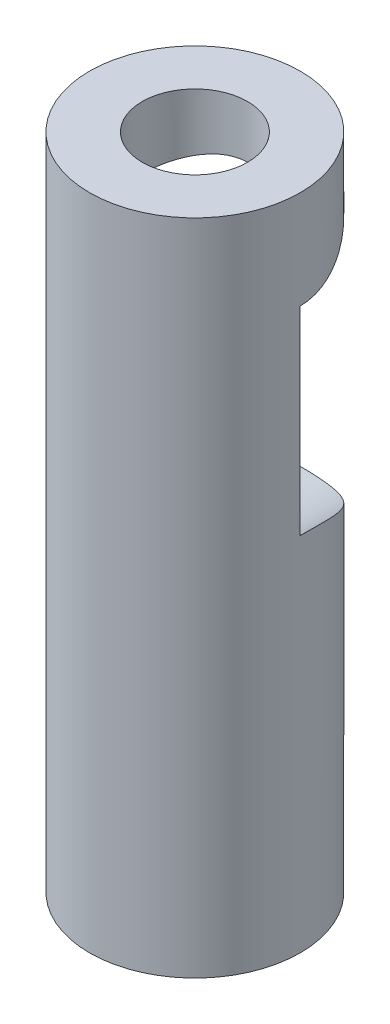
ISO-10303-21;
HEADER;
FILE_DESCRIPTION(('STEP AP214'),'2;1');
FILE_NAME('part.step','',(''),(''),'','','');
FILE_SCHEMA(('AUTOMOTIVE_DESIGN { 1 0 10303 214 1 1 1 1 }'));
ENDSEC;
DATA;
#1=APPLICATION_CONTEXT('core data for automotive mechanical design processes');
#2=APPLICATION_PROTOCOL_DEFINITION('international standard','automotive_design',2000,#1);
#3=PRODUCT_CONTEXT('',#1,'mechanical');
#4=PRODUCT('Part','Part','',(#3));
#5=PRODUCT_RELATED_PRODUCT_CATEGORY('part','',(#4));
#6=PRODUCT_DEFINITION_FORMATION('','',#4);
#7=PRODUCT_DEFINITION_CONTEXT('part definition',#1,'design');
#8=PRODUCT_DEFINITION('design','',#6,#7);
#9=PRODUCT_DEFINITION_SHAPE('','',#8);
#10=(LENGTH_UNIT() NAMED_UNIT(*) SI_UNIT(.MILLI.,.METRE.));
#11=(NAMED_UNIT(*) PLANE_ANGLE_UNIT() SI_UNIT($,.RADIAN.));
#12=(NAMED_UNIT(*) SI_UNIT($,.STERADIAN.) SOLID_ANGLE_UNIT());
#13=UNCERTAINTY_MEASURE_WITH_UNIT(LENGTH_MEASURE(1.E-05),#10,'distance_accuracy_value','');
#14=(GEOMETRIC_REPRESENTATION_CONTEXT(3) GLOBAL_UNCERTAINTY_ASSIGNED_CONTEXT((#13)) GLOBAL_UNIT_ASSIGNED_CONTEXT((#10,
#11,#12)) REPRESENTATION_CONTEXT('',''));
#15=CARTESIAN_POINT('',(0.,0.,0.));
#16=DIRECTION('',(0.,0.,1.));
#17=DIRECTION('',(1.,0.,0.));
#18=AXIS2_PLACEMENT_3D('',#15,#16,#17);
#19=CARTESIAN_POINT('',(0.,30.,0.));
#20=DIRECTION('',(0.,1.,0.));
#21=DIRECTION('',(0.,0.,1.));
#22=AXIS2_PLACEMENT_3D('',#19,#20,#21);
#23=PLANE('',#22);
#24=CARTESIAN_POINT('',(0.,30.,0.));
#25=DIRECTION('',(0.,1.,0.));
#26=DIRECTION('',(0.,0.,1.));
#27=AXIS2_PLACEMENT_3D('',#24,#25,#26);
#28=CIRCLE('',#27,8.);
#29=CARTESIAN_POINT('',(0.,30.,8.));
#30=VERTEX_POINT('',#29);
#31=EDGE_CURVE('E82',#30,#30,#28,.T.);
#32=ORIENTED_EDGE('',*,*,#31,.T.);
#33=EDGE_LOOP('',(#32));
#34=FACE_BOUND('',#33,.T.);
#35=CARTESIAN_POINT('',(0.,30.,0.));
#36=DIRECTION('',(0.,1.,0.));
#37=DIRECTION('',(0.,0.,1.));
#38=AXIS2_PLACEMENT_3D('',#35,#36,#37);
#39=CIRCLE('',#38,4.);
#40=CARTESIAN_POINT('',(0.,30.,4.));
#41=VERTEX_POINT('',#40);
#42=EDGE_CURVE('E134',#41,#41,#39,.T.);
#43=ORIENTED_EDGE('',*,*,#42,.F.);
#44=EDGE_LOOP('',(#43));
#45=FACE_BOUND('',#44,.T.);
#46=ADVANCED_FACE('F37',(#34,#45),#23,.T.);
#47=CARTESIAN_POINT('',(0.,30.,0.));
#48=DIRECTION('',(0.,-1.,0.));
#49=DIRECTION('',(0.,0.,-1.));
#50=AXIS2_PLACEMENT_3D('',#47,#48,#49);
#51=CYLINDRICAL_SURFACE('',#50,8.);
#52=CARTESIAN_POINT('',(8.,22.5498344352707,0.));
#53=CARTESIAN_POINT('',(8.00000199844028,22.5498283267748,-0.095431619735903));
#54=CARTESIAN_POINT('',(7.99829185030613,22.5516448658461,-0.190845289819358));
#55=CARTESIAN_POINT('',(7.99147154013133,22.5588636209366,-0.381401788861192));
#56=CARTESIAN_POINT('',(7.98636186658306,22.5642653217882,-0.476544654760236));
#57=CARTESIAN_POINT('',(7.96599771885704,22.5857295269759,-0.760858071430158));
#58=CARTESIAN_POINT('',(7.94570789489396,22.6070516367834,-0.949315273757999));
#59=CARTESIAN_POINT('',(7.89252079212855,22.6622153009501,-1.3201596029133));
#60=CARTESIAN_POINT('',(7.8597768360575,22.6959044357565,-1.50259232695924));
#61=CARTESIAN_POINT('',(7.78233790802606,22.7742037192679,-1.86255942916633));
#62=CARTESIAN_POINT('',(7.73763796914071,22.8188184061696,-2.04009173763416));
#63=CARTESIAN_POINT('',(7.63738241548231,22.9167701958739,-2.38808505993314));
#64=CARTESIAN_POINT('',(7.58190686269935,22.9700425233274,-2.55858762017951));
#65=CARTESIAN_POINT('',(7.4605878243306,23.0837219450238,-2.89332521759701));
#66=CARTESIAN_POINT('',(7.39474519261594,23.1441284515671,-3.0575607695594));
#67=CARTESIAN_POINT('',(7.18202214972342,23.3339411249883,-3.54161901399744));
#68=CARTESIAN_POINT('',(7.02023368527078,23.4716469626147,-3.85181522133453));
#69=CARTESIAN_POINT('',(6.73333134985199,23.6994880806395,-4.32492277679641));
#70=CARTESIAN_POINT('',(6.61980446316222,23.7863680652962,-4.4967114611119));
#71=CARTESIAN_POINT('',(6.38027991203498,23.961809481583,-4.83054999310583));
#72=CARTESIAN_POINT('',(6.25428129924246,24.0503710406664,-4.99259909867467));
#73=CARTESIAN_POINT('',(5.99010022099942,24.2273509511195,-5.30667860442995));
#74=CARTESIAN_POINT('',(5.85191139841079,24.3157692029867,-5.45870370406776));
#75=CARTESIAN_POINT('',(5.56366321018976,24.4907364893537,-5.75221313426539));
#76=CARTESIAN_POINT('',(5.4136039064722,24.5772855336001,-5.89369751979669));
#77=CARTESIAN_POINT('',(5.07268105483459,24.7628004419074,-6.19097556003177));
#78=CARTESIAN_POINT('',(4.87943558839651,24.8610603488038,-6.34449483196718));
#79=CARTESIAN_POINT('',(4.47708307115174,25.0501314431433,-6.63454822098208));
#80=CARTESIAN_POINT('',(4.2679727641795,25.1409410934611,-6.77107883597556));
#81=CARTESIAN_POINT('',(3.83513256106445,25.3124127693071,-7.0252860573472));
#82=CARTESIAN_POINT('',(3.61142698628379,25.393091052883,-7.14299295582173));
#83=CARTESIAN_POINT('',(3.15047263728153,25.5419683822454,-7.35792817177386));
#84=CARTESIAN_POINT('',(2.913230495377,25.6101734716181,-7.4551664103162));
#85=CARTESIAN_POINT('',(2.4969052441054,25.7143560433235,-7.60258490513781));
#86=CARTESIAN_POINT('',(2.32065550609699,25.7539663154778,-7.65826322171721));
#87=CARTESIAN_POINT('',(1.96318866507327,25.8249279826338,-7.75759481885437));
#88=CARTESIAN_POINT('',(1.78197270003821,25.8562812524925,-7.80125082933213));
#89=CARTESIAN_POINT('',(1.41577917682509,25.9100777208756,-7.8759422534108));
#90=CARTESIAN_POINT('',(1.23080420976254,25.932526851818,-7.90698607027195));
#91=CARTESIAN_POINT('',(0.858229931091968,25.9680652944712,-7.95605072468404));
#92=CARTESIAN_POINT('',(0.670630527866628,25.9811542785902,-7.97407110643335));
#93=CARTESIAN_POINT('',(0.293764491135456,25.9976978850496,-7.99683814861065));
#94=CARTESIAN_POINT('',(0.1044950041764,26.001130143374,-8.00155399713273));
#95=CARTESIAN_POINT('',(-0.273825049507255,25.9982181955143,-7.99754995701883));
#96=CARTESIAN_POINT('',(-0.462875617068729,25.9918740268275,-7.98883011991499));
#97=CARTESIAN_POINT('',(-0.839354698295174,25.969551159661,-7.9580879589664));
#98=CARTESIAN_POINT('',(-1.02678284905105,25.9535703593646,-7.93606273312143));
#99=CARTESIAN_POINT('',(-1.39861058323798,25.9123269855571,-7.87903975464736));
#100=CARTESIAN_POINT('',(-1.58301017600231,25.8870644406556,-7.84404204200413));
#101=CARTESIAN_POINT('',(-1.94221633406307,25.8286627365174,-7.76277722425624));
#102=CARTESIAN_POINT('',(-2.11714573492718,25.7957755436059,-7.71686963704603));
#103=CARTESIAN_POINT('',(-2.46208470434259,25.7223714164028,-7.61383969395894));
#104=CARTESIAN_POINT('',(-2.63209253063129,25.6818518174012,-7.55671342099306));
#105=CARTESIAN_POINT('',(-2.96628359405316,25.5939133808814,-7.43188840758203));
#106=CARTESIAN_POINT('',(-3.13046834683748,25.5464963552881,-7.36419244340872));
#107=CARTESIAN_POINT('',(-3.45245017139393,25.4455303171054,-7.21885195085001));
#108=CARTESIAN_POINT('',(-3.61024490082421,25.3919790829981,-7.14120381704499));
#109=CARTESIAN_POINT('',(-4.10723322439781,25.2109433781252,-6.8761398426394));
#110=CARTESIAN_POINT('',(-4.43301387434843,25.0729264243898,-6.67032326785322));
#111=CARTESIAN_POINT('',(-5.04705300069744,24.779739203316,-6.21875477141076));
#112=CARTESIAN_POINT('',(-5.33527640466488,24.6245531492814,-5.97296599677597));
#113=CARTESIAN_POINT('',(-5.76334517706154,24.37114358903,-5.55282515325631));
#114=CARTESIAN_POINT('',(-5.91600211574579,24.2753092402855,-5.38986525878157));
#115=CARTESIAN_POINT('',(-6.20709957168977,24.0830786374532,-5.05189730695535));
#116=CARTESIAN_POINT('',(-6.3455372013396,23.986682273417,-4.87688681441458));
#117=CARTESIAN_POINT('',(-6.60781580072394,23.7956304564051,-4.5151654658537));
#118=CARTESIAN_POINT('',(-6.73164763657911,23.7009761237212,-4.32844739898517));
#119=CARTESIAN_POINT('',(-6.96404304665043,23.5161100619673,-3.94367788534587));
#120=CARTESIAN_POINT('',(-7.07261079008392,23.4258971241714,-3.74562955418549));
#121=CARTESIAN_POINT('',(-7.25190718144182,23.2716775910083,-3.3825262508261));
#122=CARTESIAN_POINT('',(-7.32573885539907,23.2062262596215,-3.21961304928722));
#123=CARTESIAN_POINT('',(-7.46305429185733,23.0815482124639,-2.88707158695057));
#124=CARTESIAN_POINT('',(-7.52653489239089,23.0223234006785,-2.71744129386004));
#125=CARTESIAN_POINT('',(-7.64224618476593,22.9121700235792,-2.37255685462584));
#126=CARTESIAN_POINT('',(-7.69452031094044,22.8612096211419,-2.19732756135692));
#127=CARTESIAN_POINT('',(-7.78738008066977,22.7692337590437,-1.84133067170084));
#128=CARTESIAN_POINT('',(-7.8279743299261,22.7282109809089,-1.66056726204907));
#129=CARTESIAN_POINT('',(-7.88491923846396,22.67001191424,-1.35755790266427));
#130=CARTESIAN_POINT('',(-7.90480416197589,22.6494890050168,-1.23660426108263));
#131=CARTESIAN_POINT('',(-7.93906672936823,22.6139232999137,-0.993139038278253));
#132=CARTESIAN_POINT('',(-7.95344576281112,22.5988791213727,-0.870627858218146));
#133=CARTESIAN_POINT('',(-7.97661395080966,22.5745581204995,-0.623760947132065));
#134=CARTESIAN_POINT('',(-7.98536927038406,22.565316214815,-0.49939857380642));
#135=CARTESIAN_POINT('',(-7.99706982307064,22.5529389967196,-0.250028331880553));
#136=CARTESIAN_POINT('',(-8.00001172870602,22.5498071816098,-0.125020134638967));
#137=CARTESIAN_POINT('',(-8.,22.5498344352707,0.));
#138=B_SPLINE_CURVE_WITH_KNOTS('',3,(#52,#53,#54,#55,#56,#57,#58,#59,#60,#61,#62,#63,#64,#65,
#66,#67,#68,#69,#70,#71,#72,#73,#74,#75,#76,#77,#78,#79,#80,#81,#82,#83,#84,#85,#86,#87,#88,#89,
#90,#91,#92,#93,#94,#95,#96,#97,#98,#99,#100,#101,#102,#103,#104,#105,#106,#107,#108,#109,#110,
#111,#112,#113,#114,#115,#116,#117,#118,#119,#120,#121,#122,#123,#124,#125,#126,#127,#128,#129,
#130,#131,#132,#133,#134,#135,#136,#137),.UNSPECIFIED.,.F.,.F.,(4,2,2,2,2,2,2,2,2,2,2,2,2,2,2,2,
2,2,2,2,2,2,2,2,2,2,2,2,2,2,2,2,2,2,2,2,2,2,2,2,2,2,4),(0.,0.28622748510502,0.572413849836,
1.14358691368591,1.70794465918493,2.2725372233638,2.83308515457088,3.39358694109664,
4.51774463546238,5.18777783550204,5.85786202433252,6.52829774847315,7.19872997594122,
7.99457901458489,8.79059184078375,9.58531050369248,10.3796430786503,10.9461691263815,
11.512566426067,12.0785857248521,12.6446248325449,13.2119737557033,13.7793205028185,
14.346791037006,14.9142598220599,15.4651324703859,16.0161978031361,16.5671186339006,
17.118239616497,18.3413433364019,19.5655811757583,20.2939208323176,21.022408106442,
21.7513485587219,22.4800895205932,23.0510323499523,23.622149261184,24.1910109168413,
24.7594523571265,25.1320784078838,25.5046103541491,25.8793631428139,26.2543303700929),.UNSPECIFIED.);
#139=CARTESIAN_POINT('',(8.,22.5498344352707,0.));
#140=VERTEX_POINT('',#139);
#141=CARTESIAN_POINT('',(-8.,22.5498344352707,0.));
#142=VERTEX_POINT('',#141);
#143=EDGE_CURVE('E88',#140,#142,#138,.T.);
#144=ORIENTED_EDGE('',*,*,#143,.T.);
#145=DIRECTION('',(0.,-1.,0.));
#146=VECTOR('',#145,1.);
#147=CARTESIAN_POINT('',(-8.,30.,0.));
#148=LINE('',#147,#146);
#149=CARTESIAN_POINT('',(-8.,7.45016556472925,0.));
#150=VERTEX_POINT('',#149);
#151=EDGE_CURVE('E127',#142,#150,#148,.T.);
#152=ORIENTED_EDGE('',*,*,#151,.T.);
#153=CARTESIAN_POINT('',(-8.,7.45016556472925,0.));
#154=CARTESIAN_POINT('',(-8.00000199844028,7.45017167322521,-0.0954316197359027));
#155=CARTESIAN_POINT('',(-7.99829185030613,7.44835513415394,-0.190845289819358));
#156=CARTESIAN_POINT('',(-7.99147154013133,7.44113637906344,-0.381401788861192));
#157=CARTESIAN_POINT('',(-7.98636186658306,7.43573467821175,-0.476544654760235));
#158=CARTESIAN_POINT('',(-7.96599771885704,7.41427047302411,-0.760858071430158));
#159=CARTESIAN_POINT('',(-7.94570789489396,7.3929483632166,-0.949315273757998));
#160=CARTESIAN_POINT('',(-7.89252079212855,7.33778469904993,-1.3201596029133));
#161=CARTESIAN_POINT('',(-7.8597768360575,7.30409556424353,-1.50259232695924));
#162=CARTESIAN_POINT('',(-7.78233790802606,7.22579628073214,-1.86255942916633));
#163=CARTESIAN_POINT('',(-7.73763796914071,7.18118159383035,-2.04009173763416));
#164=CARTESIAN_POINT('',(-7.63738241548231,7.08322980412607,-2.38808505993314));
#165=CARTESIAN_POINT('',(-7.58190686269935,7.02995747667263,-2.55858762017951));
#166=CARTESIAN_POINT('',(-7.4605878243306,6.91627805497616,-2.89332521759701));
#167=CARTESIAN_POINT('',(-7.39474519261594,6.85587154843294,-3.0575607695594));
#168=CARTESIAN_POINT('',(-7.18202214972342,6.66605887501174,-3.54161901399744));
#169=CARTESIAN_POINT('',(-7.02023368527078,6.52835303738526,-3.85181522133453));
#170=CARTESIAN_POINT('',(-6.73333134985199,6.30051191936046,-4.32492277679641));
#171=CARTESIAN_POINT('',(-6.61980446316221,6.21363193470384,-4.4967114611119));
#172=CARTESIAN_POINT('',(-6.38027991203498,6.038190518417,-4.83054999310584));
#173=CARTESIAN_POINT('',(-6.25428129924246,5.94962895933363,-4.99259909867467));
#174=CARTESIAN_POINT('',(-5.99010022099942,5.77264904888048,-5.30667860442995));
#175=CARTESIAN_POINT('',(-5.85191139841079,5.68423079701328,-5.45870370406776));
#176=CARTESIAN_POINT('',(-5.56366321018976,5.50926351064626,-5.75221313426539));
#177=CARTESIAN_POINT('',(-5.4136039064722,5.42271446639989,-5.89369751979669));
#178=CARTESIAN_POINT('',(-5.07268105483459,5.23719955809264,-6.19097556003177));
#179=CARTESIAN_POINT('',(-4.87943558839651,5.13893965119624,-6.34449483196718));
#180=CARTESIAN_POINT('',(-4.47708307115174,4.94986855685671,-6.63454822098208));
#181=CARTESIAN_POINT('',(-4.2679727641795,4.85905890653886,-6.77107883597556));
#182=CARTESIAN_POINT('',(-3.83513256106445,4.6875872306929,-7.0252860573472));
#183=CARTESIAN_POINT('',(-3.61142698628379,4.60690894711702,-7.14299295582173));
#184=CARTESIAN_POINT('',(-3.15047263728153,4.45803161775459,-7.35792817177386));
#185=CARTESIAN_POINT('',(-2.913230495377,4.38982652838192,-7.4551664103162));
#186=CARTESIAN_POINT('',(-2.4969052441054,4.2856439566765,-7.60258490513781));
#187=CARTESIAN_POINT('',(-2.32065550609699,4.24603368452218,-7.65826322171721));
#188=CARTESIAN_POINT('',(-1.96318866507327,4.17507201736617,-7.75759481885438));
#189=CARTESIAN_POINT('',(-1.78197270003821,4.14371874750747,-7.80125082933213));
#190=CARTESIAN_POINT('',(-1.41577917682508,4.08992227912438,-7.8759422534108));
#191=CARTESIAN_POINT('',(-1.23080420976254,4.06747314818201,-7.90698607027195));
#192=CARTESIAN_POINT('',(-0.858229931091966,4.03193470552875,-7.95605072468404));
#193=CARTESIAN_POINT('',(-0.670630527866626,4.01884572140979,-7.97407110643335));
#194=CARTESIAN_POINT('',(-0.293764491135455,4.00230211495042,-7.99683814861065));
#195=CARTESIAN_POINT('',(-0.104495004176398,3.99886985662602,-8.00155399713273));
#196=CARTESIAN_POINT('',(0.273825049507257,4.00178180448567,-7.99754995701883));
#197=CARTESIAN_POINT('',(0.462875617068731,4.00812597317254,-7.98883011991499));
#198=CARTESIAN_POINT('',(0.839354698295174,4.03044884033903,-7.9580879589664));
#199=CARTESIAN_POINT('',(1.02678284905105,4.04642964063539,-7.93606273312143));
#200=CARTESIAN_POINT('',(1.39861058323798,4.0876730144429,-7.87903975464736));
#201=CARTESIAN_POINT('',(1.58301017600231,4.11293555934439,-7.84404204200413));
#202=CARTESIAN_POINT('',(1.94221633406308,4.17133726348265,-7.76277722425624));
#203=CARTESIAN_POINT('',(2.11714573492718,4.20422445639409,-7.71686963704603));
#204=CARTESIAN_POINT('',(2.46208470434259,4.27762858359719,-7.61383969395894));
#205=CARTESIAN_POINT('',(2.63209253063129,4.31814818259879,-7.55671342099305));
#206=CARTESIAN_POINT('',(2.96628359405316,4.40608661911864,-7.43188840758203));
#207=CARTESIAN_POINT('',(3.13046834683748,4.45350364471193,-7.36419244340872));
#208=CARTESIAN_POINT('',(3.45245017139393,4.55446968289462,-7.21885195085001));
#209=CARTESIAN_POINT('',(3.61024490082421,4.60802091700185,-7.14120381704499));
#210=CARTESIAN_POINT('',(4.10723322439781,4.78905662187485,-6.87613984263939));
#211=CARTESIAN_POINT('',(4.43301387434843,4.92707357561021,-6.67032326785321));
#212=CARTESIAN_POINT('',(5.04705300069744,5.22026079668405,-6.21875477141076));
#213=CARTESIAN_POINT('',(5.33527640466488,5.37544685071862,-5.97296599677597));
#214=CARTESIAN_POINT('',(5.76334517706154,5.62885641096995,-5.55282515325631));
#215=CARTESIAN_POINT('',(5.91600211574579,5.72469075971451,-5.38986525878157));
#216=CARTESIAN_POINT('',(6.20709957168977,5.91692136254679,-5.05189730695535));
#217=CARTESIAN_POINT('',(6.3455372013396,6.01331772658302,-4.87688681441458));
#218=CARTESIAN_POINT('',(6.60781580072394,6.2043695435949,-4.51516546585371));
#219=CARTESIAN_POINT('',(6.73164763657911,6.29902387627875,-4.32844739898517));
#220=CARTESIAN_POINT('',(6.96404304665043,6.48388993803266,-3.94367788534588));
#221=CARTESIAN_POINT('',(7.07261079008392,6.57410287582855,-3.74562955418549));
#222=CARTESIAN_POINT('',(7.25190718144182,6.72832240899172,-3.3825262508261));
#223=CARTESIAN_POINT('',(7.32573885539907,6.79377374037853,-3.21961304928722));
#224=CARTESIAN_POINT('',(7.46305429185733,6.91845178753608,-2.88707158695058));
#225=CARTESIAN_POINT('',(7.52653489239089,6.9776765993215,-2.71744129386004));
#226=CARTESIAN_POINT('',(7.64224618476593,7.08782997642081,-2.37255685462585));
#227=CARTESIAN_POINT('',(7.69452031094043,7.1387903788581,-2.19732756135692));
#228=CARTESIAN_POINT('',(7.78738008066977,7.23076624095631,-1.84133067170085));
#229=CARTESIAN_POINT('',(7.8279743299261,7.27178901909109,-1.66056726204907));
#230=CARTESIAN_POINT('',(7.88491923846395,7.32998808576001,-1.35755790266427));
#231=CARTESIAN_POINT('',(7.90480416197589,7.35051099498324,-1.23660426108263));
#232=CARTESIAN_POINT('',(7.93906672936823,7.38607670008634,-0.993139038278255));
#233=CARTESIAN_POINT('',(7.95344576281112,7.40112087862731,-0.870627858218149));
#234=CARTESIAN_POINT('',(7.97661395080966,7.42544187950053,-0.623760947132067));
#235=CARTESIAN_POINT('',(7.98536927038406,7.43468378518495,-0.499398573806422));
#236=CARTESIAN_POINT('',(7.99706982307064,7.44706100328043,-0.250028331880555));
#237=CARTESIAN_POINT('',(8.00001172870603,7.45019281839017,-0.125020134638968));
#238=CARTESIAN_POINT('',(8.,7.45016556472925,0.));
#239=B_SPLINE_CURVE_WITH_KNOTS('',3,(#153,#154,#155,#156,#157,#158,#159,#160,#161,#162,#163,
#164,#165,#166,#167,#168,#169,#170,#171,#172,#173,#174,#175,#176,#177,#178,#179,#180,#181,#182,
#183,#184,#185,#186,#187,#188,#189,#190,#191,#192,#193,#194,#195,#196,#197,#198,#199,#200,#201,
#202,#203,#204,#205,#206,#207,#208,#209,#210,#211,#212,#213,#214,#215,#216,#217,#218,#219,#220,
#221,#222,#223,#224,#225,#226,#227,#228,#229,#230,#231,#232,#233,#234,#235,#236,#237,#238),
.UNSPECIFIED.,.F.,.F.,(4,2,2,2,2,2,2,2,2,2,2,2,2,2,2,2,2,2,2,2,2,2,2,2,2,2,2,2,2,2,2,2,2,2,2,2,
2,2,2,2,2,2,4),(0.,0.28622748510502,0.572413849835999,1.14358691368591,1.70794465918493,
2.2725372233638,2.83308515457088,3.39358694109664,4.51774463546238,5.18777783550204,
5.85786202433252,6.52829774847315,7.19872997594122,7.99457901458489,8.79059184078375,
9.58531050369248,10.3796430786503,10.9461691263815,11.512566426067,12.0785857248521,
12.6446248325449,13.2119737557033,13.7793205028185,14.346791037006,14.9142598220599,
15.4651324703859,16.0161978031361,16.5671186339006,17.118239616497,18.3413433364019,
19.5655811757583,20.2939208323176,21.022408106442,21.7513485587218,22.4800895205932,
23.0510323499523,23.622149261184,24.1910109168413,24.7594523571265,25.1320784078838,
25.5046103541491,25.8793631428139,26.2543303700929),.UNSPECIFIED.);
#240=CARTESIAN_POINT('',(8.,7.45016556472925,0.));
#241=VERTEX_POINT('',#240);
#242=EDGE_CURVE('E126',#150,#241,#239,.T.);
#243=ORIENTED_EDGE('',*,*,#242,.T.);
#244=DIRECTION('',(0.,-1.,0.));
#245=VECTOR('',#244,1.);
#246=CARTESIAN_POINT('',(8.,30.,0.));
#247=LINE('',#246,#245);
#248=EDGE_CURVE('E90',#241,#140,#247,.F.);
#249=ORIENTED_EDGE('',*,*,#248,.T.);
#250=EDGE_LOOP('',(#144,#152,#243,#249));
#251=FACE_BOUND('',#250,.T.);
#252=ORIENTED_EDGE('',*,*,#31,.F.);
#253=EDGE_LOOP('',(#252));
#254=FACE_BOUND('',#253,.T.);
#255=CARTESIAN_POINT('',(0.,-20.,0.));
#256=DIRECTION('',(0.,-1.,0.));
#257=DIRECTION('',(0.,0.,-1.));
#258=AXIS2_PLACEMENT_3D('',#255,#256,#257);
#259=CIRCLE('',#258,8.);
#260=CARTESIAN_POINT('',(0.,-20.,-8.));
#261=VERTEX_POINT('',#260);
#262=EDGE_CURVE('E146',#261,#261,#259,.T.);
#263=ORIENTED_EDGE('',*,*,#262,.F.);
#264=EDGE_LOOP('',(#263));
#265=FACE_BOUND('',#264,.T.);
#266=ADVANCED_FACE('F39',(#251,#254,#265),#51,.T.);
#267=CARTESIAN_POINT('',(0.,30.,0.));
#268=DIRECTION('',(0.,-1.,0.));
#269=DIRECTION('',(0.,0.,-1.));
#270=AXIS2_PLACEMENT_3D('',#267,#268,#269);
#271=CYLINDRICAL_SURFACE('',#270,4.);
#272=DIRECTION('',(0.,-1.,0.));
#273=VECTOR('',#272,1.);
#274=CARTESIAN_POINT('',(-4.,30.,0.));
#275=LINE('',#274,#273);
#276=CARTESIAN_POINT('',(-4.,25.2469507659596,0.));
#277=VERTEX_POINT('',#276);
#278=CARTESIAN_POINT('',(-4.,4.7530492340404,0.));
#279=VERTEX_POINT('',#278);
#280=EDGE_CURVE('E11',#277,#279,#275,.T.);
#281=ORIENTED_EDGE('',*,*,#280,.F.);
#282=CARTESIAN_POINT('',(4.,25.2469507659596,0.));
#283=CARTESIAN_POINT('',(4.00001506629618,25.2469313120545,-0.108477558843029));
#284=CARTESIAN_POINT('',(3.99558759654818,25.2486728711533,-0.216944401371052));
#285=CARTESIAN_POINT('',(3.97796511816532,25.2555329689245,-0.433022618368093));
#286=CARTESIAN_POINT('',(3.96477288617618,25.2606504381169,-0.540634252841868));
#287=CARTESIAN_POINT('',(3.92979740032967,25.2740947544928,-0.753877275735285));
#288=CARTESIAN_POINT('',(3.90804329121767,25.2824107118169,-0.85951412168963));
#289=CARTESIAN_POINT('',(3.85617600406601,25.3019741161438,-1.06841189769306));
#290=CARTESIAN_POINT('',(3.82606243666696,25.3132216996918,-1.17167271683103));
#291=CARTESIAN_POINT('',(3.72361404417548,25.3508476988465,-1.47667611577799));
#292=CARTESIAN_POINT('',(3.63911135492481,25.3811339859163,-1.67400157027245));
#293=CARTESIAN_POINT('',(3.44036098803054,25.4486780931695,-2.05172943459006));
#294=CARTESIAN_POINT('',(3.32609068287348,25.485941210624,-2.23211882813923));
#295=CARTESIAN_POINT('',(3.0653542941641,25.5651741933544,-2.57927479117736));
#296=CARTESIAN_POINT('',(2.91773340595898,25.6072762987954,-2.74514569335533));
#297=CARTESIAN_POINT('',(2.59694586086137,25.690336539736,-3.05039678297012));
#298=CARTESIAN_POINT('',(2.42377439039872,25.731294457945,-3.18977196743197));
#299=CARTESIAN_POINT('',(2.0500193923818,25.8090212550311,-3.44236320126538));
#300=CARTESIAN_POINT('',(1.84874018053143,25.845615877207,-3.55460837161861));
#301=CARTESIAN_POINT('',(1.42859821417925,25.9089021162938,-3.7432716683795));
#302=CARTESIAN_POINT('',(1.20974170951164,25.9355972343031,-3.81970246356845));
#303=CARTESIAN_POINT('',(0.770126116610721,25.9751354864474,-3.93144020430173));
#304=CARTESIAN_POINT('',(0.5498088117063,25.9884992496064,-3.96829749176194));
#305=CARTESIAN_POINT('',(0.10573396147489,26.0017318475325,-4.00479875074296));
#306=CARTESIAN_POINT('',(-0.1180225752857,26.0016045658519,-4.00445343146143));
#307=CARTESIAN_POINT('',(-0.551545099906521,25.9882062518061,-3.96748382097402));
#308=CARTESIAN_POINT('',(-0.761477378236624,25.9755475501487,-3.93254965293702));
#309=CARTESIAN_POINT('',(-1.17226394649134,25.9393023123449,-3.83022333682287));
#310=CARTESIAN_POINT('',(-1.37311772136676,25.9157151570485,-3.76282934973016));
#311=CARTESIAN_POINT('',(-1.76343292952034,25.8595473870101,-3.59665837324836));
#312=CARTESIAN_POINT('',(-1.95269147493231,25.8268435212879,-3.49744827250839));
#313=CARTESIAN_POINT('',(-2.31233599066249,25.7557777457742,-3.27082630306202));
#314=CARTESIAN_POINT('',(-2.48271605149533,25.7174140730196,-3.14340564088477));
#315=CARTESIAN_POINT('',(-2.80972574444224,25.6365116612934,-2.8557775924849));
#316=CARTESIAN_POINT('',(-2.96507569246687,25.5938593571807,-2.69414776985871));
#317=CARTESIAN_POINT('',(-3.24700232649086,25.5108815019074,-2.34669408834142));
#318=CARTESIAN_POINT('',(-3.37356836574825,25.4705568158001,-2.16086131697851));
#319=CARTESIAN_POINT('',(-3.54016240956462,25.4149302410634,-1.86558976536919));
#320=CARTESIAN_POINT('',(-3.59223322579723,25.3970384333424,-1.76325823832065));
#321=CARTESIAN_POINT('',(-3.68750228530319,25.3636323383352,-1.5541882051343));
#322=CARTESIAN_POINT('',(-3.73070428236142,25.3481170458825,-1.44745158655047));
#323=CARTESIAN_POINT('',(-3.80779139446805,25.3200005007808,-1.2304361889591));
#324=CARTESIAN_POINT('',(-3.8416871452191,25.3073959242428,-1.1201616157295));
#325=CARTESIAN_POINT('',(-3.8998727091522,25.2855215725494,-0.896828970336788));
#326=CARTESIAN_POINT('',(-3.92416687098898,25.2762502878854,-0.78377218296893));
#327=CARTESIAN_POINT('',(-3.96229165305801,25.2616115978763,-0.559278614183592));
#328=CARTESIAN_POINT('',(-3.97642329254164,25.2561320834074,-0.447900257838537));
#329=CARTESIAN_POINT('',(-3.99528154959869,25.2487922541277,-0.224351065921796));
#330=CARTESIAN_POINT('',(-4.00001800323396,25.2469281542918,-0.112181182661626));
#331=CARTESIAN_POINT('',(-4.,25.2469507659596,0.));
#332=B_SPLINE_CURVE_WITH_KNOTS('',3,(#282,#283,#284,#285,#286,#287,#288,#289,#290,#291,#292,
#293,#294,#295,#296,#297,#298,#299,#300,#301,#302,#303,#304,#305,#306,#307,#308,#309,#310,#311,
#312,#313,#314,#315,#316,#317,#318,#319,#320,#321,#322,#323,#324,#325,#326,#327,#328,#329,#330,
#331),.UNSPECIFIED.,.F.,.F.,(4,2,2,2,2,2,2,2,2,2,2,2,2,2,2,2,2,2,2,2,2,2,2,2,4),(0.,
0.325310395428347,0.650517782781825,0.974627603491258,1.29875252283213,1.94591304532233,
2.59356694227547,3.26854149378252,3.94364336903227,4.64017640395484,5.33646286474439,
6.00434645390944,6.67203778562602,7.30863725983086,7.94527280491034,8.59097152050376,
9.23687178993661,9.9184556128784,10.6002911350355,10.9485318545547,11.2966248736591,
11.6443184006235,11.9918542727889,12.3286166822483,12.665026340001),.UNSPECIFIED.);
#333=CARTESIAN_POINT('',(4.,25.2469507659596,0.));
#334=VERTEX_POINT('',#333);
#335=EDGE_CURVE('E81',#334,#277,#332,.T.);
#336=ORIENTED_EDGE('',*,*,#335,.F.);
#337=DIRECTION('',(0.,-1.,0.));
#338=VECTOR('',#337,1.);
#339=CARTESIAN_POINT('',(4.,30.,0.));
#340=LINE('',#339,#338);
#341=CARTESIAN_POINT('',(4.,4.7530492340404,0.));
#342=VERTEX_POINT('',#341);
#343=EDGE_CURVE('E76',#342,#334,#340,.F.);
#344=ORIENTED_EDGE('',*,*,#343,.F.);
#345=CARTESIAN_POINT('',(-4.,4.7530492340404,0.));
#346=CARTESIAN_POINT('',(-4.00001506629618,4.7530686879455,-0.108477558843029));
#347=CARTESIAN_POINT('',(-3.99558759654818,4.75132712884673,-0.216944401371052));
#348=CARTESIAN_POINT('',(-3.97796511816532,4.74446703107549,-0.433022618368093));
#349=CARTESIAN_POINT('',(-3.96477288617618,4.73934956188305,-0.540634252841868));
#350=CARTESIAN_POINT('',(-3.92979740032967,4.72590524550724,-0.753877275735285));
#351=CARTESIAN_POINT('',(-3.90804329121767,4.71758928818309,-0.85951412168963));
#352=CARTESIAN_POINT('',(-3.85617600406601,4.69802588385616,-1.06841189769306));
#353=CARTESIAN_POINT('',(-3.82606243666696,4.6867783003082,-1.17167271683103));
#354=CARTESIAN_POINT('',(-3.72361404417548,4.6491523011535,-1.47667611577799));
#355=CARTESIAN_POINT('',(-3.63911135492481,4.61886601408374,-1.67400157027245));
#356=CARTESIAN_POINT('',(-3.44036098803054,4.55132190683054,-2.05172943459006));
#357=CARTESIAN_POINT('',(-3.32609068287348,4.51405878937601,-2.23211882813923));
#358=CARTESIAN_POINT('',(-3.0653542941641,4.43482580664555,-2.57927479117736));
#359=CARTESIAN_POINT('',(-2.91773340595898,4.39272370120459,-2.74514569335533));
#360=CARTESIAN_POINT('',(-2.59694586086137,4.30966346026395,-3.05039678297012));
#361=CARTESIAN_POINT('',(-2.42377439039872,4.26870554205502,-3.18977196743197));
#362=CARTESIAN_POINT('',(-2.0500193923818,4.19097874496894,-3.44236320126538));
#363=CARTESIAN_POINT('',(-1.84874018053143,4.15438412279298,-3.55460837161861));
#364=CARTESIAN_POINT('',(-1.42859821417925,4.09109788370617,-3.7432716683795));
#365=CARTESIAN_POINT('',(-1.20974170951164,4.06440276569694,-3.81970246356845));
#366=CARTESIAN_POINT('',(-0.770126116610722,4.02486451355257,-3.93144020430173));
#367=CARTESIAN_POINT('',(-0.549808811706302,4.01150075039356,-3.96829749176194));
#368=CARTESIAN_POINT('',(-0.105733961474892,3.99826815246751,-4.00479875074296));
#369=CARTESIAN_POINT('',(0.118022575285698,3.99839543414808,-4.00445343146143));
#370=CARTESIAN_POINT('',(0.55154509990652,4.01179374819387,-3.96748382097402));
#371=CARTESIAN_POINT('',(0.761477378236623,4.02445244985134,-3.93254965293702));
#372=CARTESIAN_POINT('',(1.17226394649134,4.06069768765506,-3.83022333682287));
#373=CARTESIAN_POINT('',(1.37311772136676,4.08428484295147,-3.76282934973016));
#374=CARTESIAN_POINT('',(1.76343292952034,4.1404526129899,-3.59665837324836));
#375=CARTESIAN_POINT('',(1.95269147493231,4.17315647871207,-3.49744827250839));
#376=CARTESIAN_POINT('',(2.31233599066249,4.2442222542258,-3.27082630306202));
#377=CARTESIAN_POINT('',(2.48271605149533,4.28258592698037,-3.14340564088477));
#378=CARTESIAN_POINT('',(2.80972574444224,4.36348833870661,-2.8557775924849));
#379=CARTESIAN_POINT('',(2.96507569246687,4.40614064281928,-2.69414776985871));
#380=CARTESIAN_POINT('',(3.24700232649086,4.48911849809259,-2.34669408834142));
#381=CARTESIAN_POINT('',(3.37356836574825,4.52944318419986,-2.16086131697851));
#382=CARTESIAN_POINT('',(3.54016240956462,4.58506975893664,-1.86558976536919));
#383=CARTESIAN_POINT('',(3.59223322579723,4.60296156665764,-1.76325823832065));
#384=CARTESIAN_POINT('',(3.68750228530319,4.63636766166479,-1.5541882051343));
#385=CARTESIAN_POINT('',(3.73070428236142,4.6518829541175,-1.44745158655047));
#386=CARTESIAN_POINT('',(3.80779139446805,4.67999949921925,-1.2304361889591));
#387=CARTESIAN_POINT('',(3.8416871452191,4.69260407575721,-1.1201616157295));
#388=CARTESIAN_POINT('',(3.8998727091522,4.71447842745056,-0.896828970336789));
#389=CARTESIAN_POINT('',(3.92416687098898,4.72374971211462,-0.783772182968931));
#390=CARTESIAN_POINT('',(3.96229165305801,4.73838840212368,-0.559278614183594));
#391=CARTESIAN_POINT('',(3.97642329254164,4.74386791659256,-0.447900257838539));
#392=CARTESIAN_POINT('',(3.99528154959869,4.75120774587225,-0.224351065921797));
#393=CARTESIAN_POINT('',(4.00001800323396,4.75307184570818,-0.112181182661626));
#394=CARTESIAN_POINT('',(4.,4.7530492340404,0.));
#395=B_SPLINE_CURVE_WITH_KNOTS('',3,(#345,#346,#347,#348,#349,#350,#351,#352,#353,#354,#355,
#356,#357,#358,#359,#360,#361,#362,#363,#364,#365,#366,#367,#368,#369,#370,#371,#372,#373,#374,
#375,#376,#377,#378,#379,#380,#381,#382,#383,#384,#385,#386,#387,#388,#389,#390,#391,#392,#393,
#394),.UNSPECIFIED.,.F.,.F.,(4,2,2,2,2,2,2,2,2,2,2,2,2,2,2,2,2,2,2,2,2,2,2,2,4),(0.,
0.325310395428347,0.650517782781826,0.974627603491258,1.29875252283213,1.94591304532233,
2.59356694227547,3.26854149378252,3.94364336903227,4.64017640395484,5.33646286474439,
6.00434645390944,6.67203778562602,7.30863725983086,7.94527280491034,8.59097152050376,
9.23687178993661,9.9184556128784,10.6002911350355,10.9485318545547,11.2966248736591,
11.6443184006235,11.9918542727889,12.3286166822483,12.665026340001),.UNSPECIFIED.);
#396=EDGE_CURVE('E46',#279,#342,#395,.T.);
#397=ORIENTED_EDGE('',*,*,#396,.F.);
#398=EDGE_LOOP('',(#281,#336,#344,#397));
#399=FACE_BOUND('',#398,.T.);
#400=ORIENTED_EDGE('',*,*,#42,.T.);
#401=EDGE_LOOP('',(#400));
#402=FACE_BOUND('',#401,.T.);
#403=CARTESIAN_POINT('',(0.,-20.,0.));
#404=DIRECTION('',(0.,-1.,0.));
#405=DIRECTION('',(0.,0.,-1.));
#406=AXIS2_PLACEMENT_3D('',#403,#404,#405);
#407=CIRCLE('',#406,4.);
#408=CARTESIAN_POINT('',(0.,-20.,-4.));
#409=VERTEX_POINT('',#408);
#410=EDGE_CURVE('E148',#409,#409,#407,.T.);
#411=ORIENTED_EDGE('',*,*,#410,.T.);
#412=EDGE_LOOP('',(#411));
#413=FACE_BOUND('',#412,.T.);
#414=ADVANCED_FACE('F94',(#399,#402,#413),#271,.F.);
#415=CARTESIAN_POINT('',(0.,15.,-8.));
#416=DIRECTION('',(0.,0.,1.));
#417=DIRECTION('',(1.,0.,0.));
#418=AXIS2_PLACEMENT_3D('',#415,#416,#417);
#419=CYLINDRICAL_SURFACE('',#418,11.);
#420=CARTESIAN_POINT('',(0.,15.,0.));
#421=DIRECTION('',(0.,0.,1.));
#422=DIRECTION('',(1.,0.,0.));
#423=AXIS2_PLACEMENT_3D('',#420,#421,#422);
#424=CIRCLE('',#423,11.);
#425=EDGE_CURVE('E150',#150,#279,#424,.T.);
#426=ORIENTED_EDGE('',*,*,#425,.T.);
#427=ORIENTED_EDGE('',*,*,#396,.T.);
#428=EDGE_CURVE('E58',#342,#241,#424,.T.);
#429=ORIENTED_EDGE('',*,*,#428,.T.);
#430=ORIENTED_EDGE('',*,*,#242,.F.);
#431=EDGE_LOOP('',(#426,#427,#429,#430));
#432=FACE_BOUND('',#431,.T.);
#433=ADVANCED_FACE('F109',(#432),#419,.F.);
#434=EDGE_CURVE('E53',#140,#334,#424,.T.);
#435=ORIENTED_EDGE('',*,*,#434,.T.);
#436=ORIENTED_EDGE('',*,*,#335,.T.);
#437=EDGE_CURVE('E91',#277,#142,#424,.T.);
#438=ORIENTED_EDGE('',*,*,#437,.T.);
#439=ORIENTED_EDGE('',*,*,#143,.F.);
#440=EDGE_LOOP('',(#435,#436,#438,#439));
#441=FACE_BOUND('',#440,.T.);
#442=ADVANCED_FACE('F85',(#441),#419,.F.);
#443=CARTESIAN_POINT('',(0.,15.,0.));
#444=DIRECTION('',(0.,0.,1.));
#445=DIRECTION('',(1.,0.,0.));
#446=AXIS2_PLACEMENT_3D('',#443,#444,#445);
#447=PLANE('',#446);
#448=ORIENTED_EDGE('',*,*,#437,.F.);
#449=ORIENTED_EDGE('',*,*,#280,.T.);
#450=ORIENTED_EDGE('',*,*,#425,.F.);
#451=ORIENTED_EDGE('',*,*,#151,.F.);
#452=EDGE_LOOP('',(#448,#449,#450,#451));
#453=FACE_BOUND('',#452,.T.);
#454=ADVANCED_FACE('F114',(#453),#447,.F.);
#455=ORIENTED_EDGE('',*,*,#428,.F.);
#456=ORIENTED_EDGE('',*,*,#343,.T.);
#457=ORIENTED_EDGE('',*,*,#434,.F.);
#458=ORIENTED_EDGE('',*,*,#248,.F.);
#459=EDGE_LOOP('',(#455,#456,#457,#458));
#460=FACE_BOUND('',#459,.T.);
#461=ADVANCED_FACE('F77',(#460),#447,.F.);
#462=CARTESIAN_POINT('',(0.,-20.,0.));
#463=DIRECTION('',(0.,-1.,0.));
#464=DIRECTION('',(0.,0.,-1.));
#465=AXIS2_PLACEMENT_3D('',#462,#463,#464);
#466=PLANE('',#465);
#467=ORIENTED_EDGE('',*,*,#262,.T.);
#468=EDGE_LOOP('',(#467));
#469=FACE_BOUND('',#468,.T.);
#470=ORIENTED_EDGE('',*,*,#410,.F.);
#471=EDGE_LOOP('',(#470));
#472=FACE_BOUND('',#471,.T.);
#473=ADVANCED_FACE('F163',(#469,#472),#466,.T.);
#474=CLOSED_SHELL('',(#46,#266,#414,#433,#442,#454,#461,#473));
#475=MANIFOLD_SOLID_BREP('B2',#474);
#476=ADVANCED_BREP_SHAPE_REPRESENTATION('',(#18,#475),#14);
#477=SHAPE_DEFINITION_REPRESENTATION(#9,#476);
ENDSEC;
END-ISO-10303-21;
